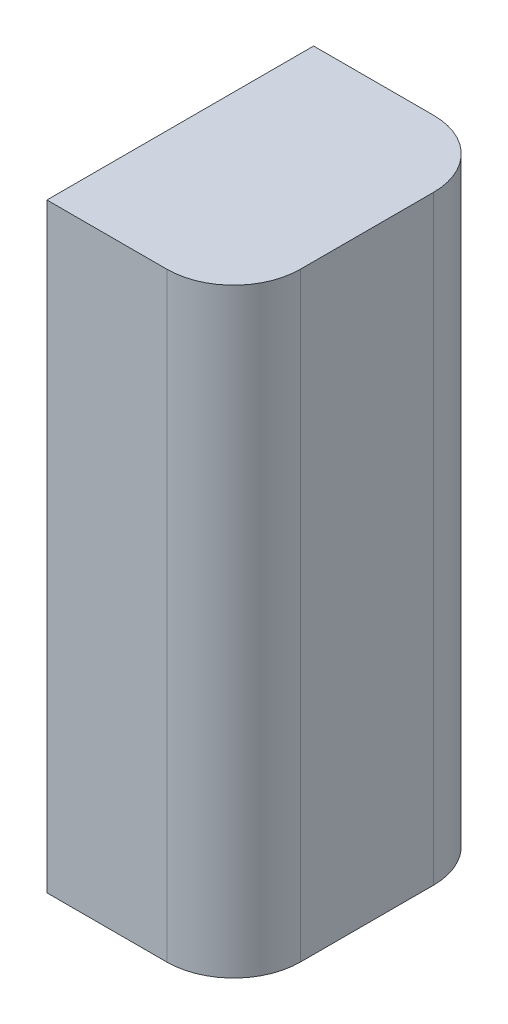
ISO-10303-21;
HEADER;
FILE_DESCRIPTION(('STEP AP214'),'2;1');
FILE_NAME('part.step','',(''),(''),'','','');
FILE_SCHEMA(('AUTOMOTIVE_DESIGN { 1 0 10303 214 1 1 1 1 }'));
ENDSEC;
DATA;
#1=APPLICATION_CONTEXT('core data for automotive mechanical design processes');
#2=APPLICATION_PROTOCOL_DEFINITION('international standard','automotive_design',2000,#1);
#3=PRODUCT_CONTEXT('',#1,'mechanical');
#4=PRODUCT('Part','Part','',(#3));
#5=PRODUCT_RELATED_PRODUCT_CATEGORY('part','',(#4));
#6=PRODUCT_DEFINITION_FORMATION('','',#4);
#7=PRODUCT_DEFINITION_CONTEXT('part definition',#1,'design');
#8=PRODUCT_DEFINITION('design','',#6,#7);
#9=PRODUCT_DEFINITION_SHAPE('','',#8);
#10=(LENGTH_UNIT() NAMED_UNIT(*) SI_UNIT(.MILLI.,.METRE.));
#11=(NAMED_UNIT(*) PLANE_ANGLE_UNIT() SI_UNIT($,.RADIAN.));
#12=(NAMED_UNIT(*) SI_UNIT($,.STERADIAN.) SOLID_ANGLE_UNIT());
#13=UNCERTAINTY_MEASURE_WITH_UNIT(LENGTH_MEASURE(1.E-05),#10,'distance_accuracy_value','');
#14=(GEOMETRIC_REPRESENTATION_CONTEXT(3) GLOBAL_UNCERTAINTY_ASSIGNED_CONTEXT((#13)) GLOBAL_UNIT_ASSIGNED_CONTEXT((#10,
#11,#12)) REPRESENTATION_CONTEXT('',''));
#15=CARTESIAN_POINT('',(0.,0.,0.));
#16=DIRECTION('',(0.,0.,1.));
#17=DIRECTION('',(1.,0.,0.));
#18=AXIS2_PLACEMENT_3D('',#15,#16,#17);
#19=CARTESIAN_POINT('',(0.,285.75,0.));
#20=DIRECTION('',(1.,0.,0.));
#21=DIRECTION('',(0.,0.,-1.));
#22=AXIS2_PLACEMENT_3D('',#19,#20,#21);
#23=PLANE('',#22);
#24=DIRECTION('',(0.,0.,1.));
#25=VECTOR('',#24,1.);
#26=CARTESIAN_POINT('',(0.,0.,0.));
#27=LINE('',#26,#25);
#28=CARTESIAN_POINT('',(0.,0.,-127.));
#29=VERTEX_POINT('',#28);
#30=CARTESIAN_POINT('',(0.,0.,0.));
#31=VERTEX_POINT('',#30);
#32=EDGE_CURVE('E125',#29,#31,#27,.T.);
#33=ORIENTED_EDGE('',*,*,#32,.T.);
#34=DIRECTION('',(0.,-1.,0.));
#35=VECTOR('',#34,1.);
#36=CARTESIAN_POINT('',(0.,285.75,0.));
#37=LINE('',#36,#35);
#38=CARTESIAN_POINT('',(0.,285.75,0.));
#39=VERTEX_POINT('',#38);
#40=EDGE_CURVE('E11',#39,#31,#37,.T.);
#41=ORIENTED_EDGE('',*,*,#40,.F.);
#42=DIRECTION('',(0.,0.,1.));
#43=VECTOR('',#42,1.);
#44=CARTESIAN_POINT('',(0.,285.75,0.));
#45=LINE('',#44,#43);
#46=CARTESIAN_POINT('',(0.,285.75,-127.));
#47=VERTEX_POINT('',#46);
#48=EDGE_CURVE('E136',#47,#39,#45,.T.);
#49=ORIENTED_EDGE('',*,*,#48,.F.);
#50=DIRECTION('',(0.,-1.,0.));
#51=VECTOR('',#50,1.);
#52=CARTESIAN_POINT('',(0.,285.75,-127.));
#53=LINE('',#52,#51);
#54=EDGE_CURVE('E121',#47,#29,#53,.T.);
#55=ORIENTED_EDGE('',*,*,#54,.T.);
#56=EDGE_LOOP('',(#33,#41,#49,#55));
#57=FACE_BOUND('',#56,.T.);
#58=ADVANCED_FACE('F41',(#57),#23,.F.);
#59=CARTESIAN_POINT('',(0.,285.75,0.));
#60=DIRECTION('',(0.,0.,-1.));
#61=DIRECTION('',(-1.,0.,0.));
#62=AXIS2_PLACEMENT_3D('',#59,#60,#61);
#63=PLANE('',#62);
#64=DIRECTION('',(1.,0.,0.));
#65=VECTOR('',#64,1.);
#66=CARTESIAN_POINT('',(0.,0.,0.));
#67=LINE('',#66,#65);
#68=CARTESIAN_POINT('',(57.1499999999998,0.,0.));
#69=VERTEX_POINT('',#68);
#70=EDGE_CURVE('E128',#31,#69,#67,.T.);
#71=ORIENTED_EDGE('',*,*,#70,.T.);
#72=DIRECTION('',(0.,-1.,0.));
#73=VECTOR('',#72,1.);
#74=CARTESIAN_POINT('',(57.1499999999998,285.75,0.));
#75=LINE('',#74,#73);
#76=CARTESIAN_POINT('',(57.1499999999998,285.75,0.));
#77=VERTEX_POINT('',#76);
#78=EDGE_CURVE('E49',#77,#69,#75,.T.);
#79=ORIENTED_EDGE('',*,*,#78,.F.);
#80=DIRECTION('',(1.,0.,0.));
#81=VECTOR('',#80,1.);
#82=CARTESIAN_POINT('',(0.,285.75,0.));
#83=LINE('',#82,#81);
#84=EDGE_CURVE('E94',#39,#77,#83,.T.);
#85=ORIENTED_EDGE('',*,*,#84,.F.);
#86=ORIENTED_EDGE('',*,*,#40,.T.);
#87=EDGE_LOOP('',(#71,#79,#85,#86));
#88=FACE_BOUND('',#87,.T.);
#89=ADVANCED_FACE('F162',(#88),#63,.F.);
#90=CARTESIAN_POINT('',(57.15,285.75,-31.75));
#91=DIRECTION('',(0.,-1.,0.));
#92=DIRECTION('',(0.,0.,-1.));
#93=AXIS2_PLACEMENT_3D('',#90,#91,#92);
#94=CYLINDRICAL_SURFACE('',#93,31.75);
#95=CARTESIAN_POINT('',(57.15,0.,-31.75));
#96=DIRECTION('',(0.,1.,0.));
#97=DIRECTION('',(0.,0.,1.));
#98=AXIS2_PLACEMENT_3D('',#95,#96,#97);
#99=CIRCLE('',#98,31.75);
#100=CARTESIAN_POINT('',(88.9,0.,-31.7500000000002));
#101=VERTEX_POINT('',#100);
#102=EDGE_CURVE('E130',#69,#101,#99,.T.);
#103=ORIENTED_EDGE('',*,*,#102,.T.);
#104=DIRECTION('',(0.,-1.,0.));
#105=VECTOR('',#104,1.);
#106=CARTESIAN_POINT('',(88.9,285.75,-31.7500000000002));
#107=LINE('',#106,#105);
#108=CARTESIAN_POINT('',(88.9,285.75,-31.7500000000002));
#109=VERTEX_POINT('',#108);
#110=EDGE_CURVE('E116',#109,#101,#107,.T.);
#111=ORIENTED_EDGE('',*,*,#110,.F.);
#112=CARTESIAN_POINT('',(57.15,285.75,-31.75));
#113=DIRECTION('',(0.,1.,0.));
#114=DIRECTION('',(0.,0.,1.));
#115=AXIS2_PLACEMENT_3D('',#112,#113,#114);
#116=CIRCLE('',#115,31.75);
#117=EDGE_CURVE('E107',#77,#109,#116,.T.);
#118=ORIENTED_EDGE('',*,*,#117,.F.);
#119=ORIENTED_EDGE('',*,*,#78,.T.);
#120=EDGE_LOOP('',(#103,#111,#118,#119));
#121=FACE_BOUND('',#120,.T.);
#122=ADVANCED_FACE('F144',(#121),#94,.T.);
#123=CARTESIAN_POINT('',(88.9,285.75,-31.7500000000002));
#124=DIRECTION('',(-1.,0.,0.));
#125=DIRECTION('',(0.,0.,1.));
#126=AXIS2_PLACEMENT_3D('',#123,#124,#125);
#127=PLANE('',#126);
#128=DIRECTION('',(0.,0.,-1.));
#129=VECTOR('',#128,1.);
#130=CARTESIAN_POINT('',(88.9,0.,-31.7500000000002));
#131=LINE('',#130,#129);
#132=CARTESIAN_POINT('',(88.9,0.,-95.2499999999998));
#133=VERTEX_POINT('',#132);
#134=EDGE_CURVE('E115',#101,#133,#131,.T.);
#135=ORIENTED_EDGE('',*,*,#134,.T.);
#136=DIRECTION('',(0.,-1.,0.));
#137=VECTOR('',#136,1.);
#138=CARTESIAN_POINT('',(88.9,285.75,-95.2499999999998));
#139=LINE('',#138,#137);
#140=CARTESIAN_POINT('',(88.9,285.75,-95.2499999999998));
#141=VERTEX_POINT('',#140);
#142=EDGE_CURVE('E112',#141,#133,#139,.T.);
#143=ORIENTED_EDGE('',*,*,#142,.F.);
#144=DIRECTION('',(0.,0.,-1.));
#145=VECTOR('',#144,1.);
#146=CARTESIAN_POINT('',(88.9,285.75,-31.7500000000002));
#147=LINE('',#146,#145);
#148=EDGE_CURVE('E101',#109,#141,#147,.T.);
#149=ORIENTED_EDGE('',*,*,#148,.F.);
#150=ORIENTED_EDGE('',*,*,#110,.T.);
#151=EDGE_LOOP('',(#135,#143,#149,#150));
#152=FACE_BOUND('',#151,.T.);
#153=ADVANCED_FACE('F113',(#152),#127,.F.);
#154=CARTESIAN_POINT('',(57.15,285.75,-95.25));
#155=DIRECTION('',(0.,-1.,0.));
#156=DIRECTION('',(0.,0.,-1.));
#157=AXIS2_PLACEMENT_3D('',#154,#155,#156);
#158=CYLINDRICAL_SURFACE('',#157,31.75);
#159=CARTESIAN_POINT('',(57.15,0.,-95.25));
#160=DIRECTION('',(0.,1.,0.));
#161=DIRECTION('',(0.,0.,-1.));
#162=AXIS2_PLACEMENT_3D('',#159,#160,#161);
#163=CIRCLE('',#162,31.75);
#164=CARTESIAN_POINT('',(57.1499999999998,0.,-127.));
#165=VERTEX_POINT('',#164);
#166=EDGE_CURVE('E80',#133,#165,#163,.T.);
#167=ORIENTED_EDGE('',*,*,#166,.T.);
#168=DIRECTION('',(0.,-1.,0.));
#169=VECTOR('',#168,1.);
#170=CARTESIAN_POINT('',(57.1499999999998,285.75,-127.));
#171=LINE('',#170,#169);
#172=CARTESIAN_POINT('',(57.1499999999998,285.75,-127.));
#173=VERTEX_POINT('',#172);
#174=EDGE_CURVE('E117',#173,#165,#171,.T.);
#175=ORIENTED_EDGE('',*,*,#174,.F.);
#176=CARTESIAN_POINT('',(57.15,285.75,-95.25));
#177=DIRECTION('',(0.,1.,0.));
#178=DIRECTION('',(0.,0.,-1.));
#179=AXIS2_PLACEMENT_3D('',#176,#177,#178);
#180=CIRCLE('',#179,31.75);
#181=EDGE_CURVE('E105',#141,#173,#180,.T.);
#182=ORIENTED_EDGE('',*,*,#181,.F.);
#183=ORIENTED_EDGE('',*,*,#142,.T.);
#184=EDGE_LOOP('',(#167,#175,#182,#183));
#185=FACE_BOUND('',#184,.T.);
#186=ADVANCED_FACE('F119',(#185),#158,.T.);
#187=CARTESIAN_POINT('',(0.,285.75,-127.));
#188=DIRECTION('',(0.,0.,1.));
#189=DIRECTION('',(1.,0.,0.));
#190=AXIS2_PLACEMENT_3D('',#187,#188,#189);
#191=PLANE('',#190);
#192=DIRECTION('',(-1.,0.,0.));
#193=VECTOR('',#192,1.);
#194=CARTESIAN_POINT('',(0.,0.,-127.));
#195=LINE('',#194,#193);
#196=EDGE_CURVE('E86',#165,#29,#195,.T.);
#197=ORIENTED_EDGE('',*,*,#196,.T.);
#198=ORIENTED_EDGE('',*,*,#54,.F.);
#199=DIRECTION('',(-1.,0.,0.));
#200=VECTOR('',#199,1.);
#201=CARTESIAN_POINT('',(0.,285.75,-127.));
#202=LINE('',#201,#200);
#203=EDGE_CURVE('E57',#173,#47,#202,.T.);
#204=ORIENTED_EDGE('',*,*,#203,.F.);
#205=ORIENTED_EDGE('',*,*,#174,.T.);
#206=EDGE_LOOP('',(#197,#198,#204,#205));
#207=FACE_BOUND('',#206,.T.);
#208=ADVANCED_FACE('F151',(#207),#191,.F.);
#209=CARTESIAN_POINT('',(57.15,285.75,-95.25));
#210=DIRECTION('',(0.,-1.,0.));
#211=DIRECTION('',(0.,0.,-1.));
#212=AXIS2_PLACEMENT_3D('',#209,#210,#211);
#213=PLANE('',#212);
#214=ORIENTED_EDGE('',*,*,#48,.T.);
#215=ORIENTED_EDGE('',*,*,#84,.T.);
#216=ORIENTED_EDGE('',*,*,#117,.T.);
#217=ORIENTED_EDGE('',*,*,#148,.T.);
#218=ORIENTED_EDGE('',*,*,#181,.T.);
#219=ORIENTED_EDGE('',*,*,#203,.T.);
#220=EDGE_LOOP('',(#214,#215,#216,#217,#218,#219));
#221=FACE_BOUND('',#220,.T.);
#222=ADVANCED_FACE('F103',(#221),#213,.F.);
#223=CARTESIAN_POINT('',(57.15,0.,-95.25));
#224=DIRECTION('',(0.,-1.,0.));
#225=DIRECTION('',(0.,0.,-1.));
#226=AXIS2_PLACEMENT_3D('',#223,#224,#225);
#227=PLANE('',#226);
#228=ORIENTED_EDGE('',*,*,#32,.F.);
#229=ORIENTED_EDGE('',*,*,#196,.F.);
#230=ORIENTED_EDGE('',*,*,#166,.F.);
#231=ORIENTED_EDGE('',*,*,#134,.F.);
#232=ORIENTED_EDGE('',*,*,#102,.F.);
#233=ORIENTED_EDGE('',*,*,#70,.F.);
#234=EDGE_LOOP('',(#228,#229,#230,#231,#232,#233));
#235=FACE_BOUND('',#234,.T.);
#236=ADVANCED_FACE('F147',(#235),#227,.T.);
#237=CLOSED_SHELL('',(#58,#89,#122,#153,#186,#208,#222,#236));
#238=MANIFOLD_SOLID_BREP('B2',#237);
#239=ADVANCED_BREP_SHAPE_REPRESENTATION('',(#18,#238),#14);
#240=SHAPE_DEFINITION_REPRESENTATION(#9,#239);
ENDSEC;
END-ISO-10303-21;
